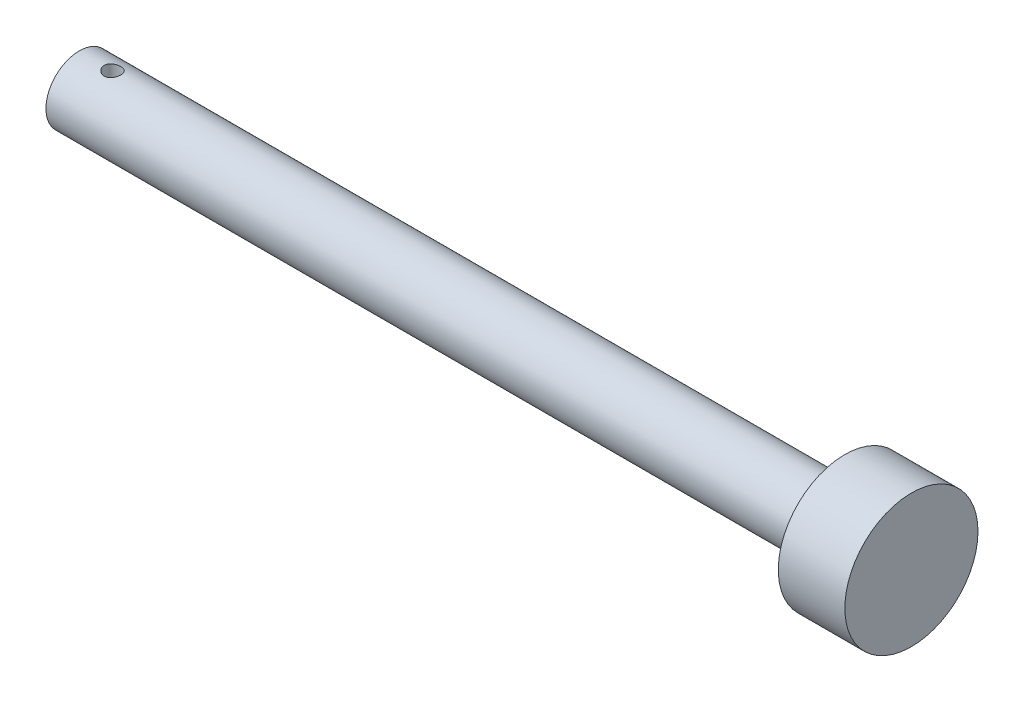
ISO-10303-21;
HEADER;
FILE_DESCRIPTION(('STEP AP214'),'2;1');
FILE_NAME('part.step','',(''),(''),'','','');
FILE_SCHEMA(('AUTOMOTIVE_DESIGN { 1 0 10303 214 1 1 1 1 }'));
ENDSEC;
DATA;
#1=APPLICATION_CONTEXT('core data for automotive mechanical design processes');
#2=APPLICATION_PROTOCOL_DEFINITION('international standard','automotive_design',2000,#1);
#3=PRODUCT_CONTEXT('',#1,'mechanical');
#4=PRODUCT('Part','Part','',(#3));
#5=PRODUCT_RELATED_PRODUCT_CATEGORY('part','',(#4));
#6=PRODUCT_DEFINITION_FORMATION('','',#4);
#7=PRODUCT_DEFINITION_CONTEXT('part definition',#1,'design');
#8=PRODUCT_DEFINITION('design','',#6,#7);
#9=PRODUCT_DEFINITION_SHAPE('','',#8);
#10=(LENGTH_UNIT() NAMED_UNIT(*) SI_UNIT(.MILLI.,.METRE.));
#11=(NAMED_UNIT(*) PLANE_ANGLE_UNIT() SI_UNIT($,.RADIAN.));
#12=(NAMED_UNIT(*) SI_UNIT($,.STERADIAN.) SOLID_ANGLE_UNIT());
#13=UNCERTAINTY_MEASURE_WITH_UNIT(LENGTH_MEASURE(1.E-05),#10,'distance_accuracy_value','');
#14=(GEOMETRIC_REPRESENTATION_CONTEXT(3) GLOBAL_UNCERTAINTY_ASSIGNED_CONTEXT((#13)) GLOBAL_UNIT_ASSIGNED_CONTEXT((#10,
#11,#12)) REPRESENTATION_CONTEXT('',''));
#15=CARTESIAN_POINT('',(0.,0.,0.));
#16=DIRECTION('',(0.,0.,1.));
#17=DIRECTION('',(1.,0.,0.));
#18=AXIS2_PLACEMENT_3D('',#15,#16,#17);
#19=CARTESIAN_POINT('',(16.,0.,0.));
#20=DIRECTION('',(-1.,0.,0.));
#21=DIRECTION('',(0.,0.,1.));
#22=AXIS2_PLACEMENT_3D('',#19,#20,#21);
#23=CYLINDRICAL_SURFACE('',#22,16.);
#24=CARTESIAN_POINT('',(16.,0.,0.));
#25=DIRECTION('',(1.,0.,0.));
#26=DIRECTION('',(0.,0.,-1.));
#27=AXIS2_PLACEMENT_3D('',#24,#25,#26);
#28=CIRCLE('',#27,16.);
#29=CARTESIAN_POINT('',(16.,0.,-16.));
#30=VERTEX_POINT('',#29);
#31=EDGE_CURVE('E10',#30,#30,#28,.T.);
#32=ORIENTED_EDGE('',*,*,#31,.F.);
#33=EDGE_LOOP('',(#32));
#34=FACE_BOUND('',#33,.T.);
#35=CARTESIAN_POINT('',(0.,0.,0.));
#36=DIRECTION('',(1.,0.,0.));
#37=DIRECTION('',(0.,0.,-1.));
#38=AXIS2_PLACEMENT_3D('',#35,#36,#37);
#39=CIRCLE('',#38,16.);
#40=CARTESIAN_POINT('',(0.,0.,-16.));
#41=VERTEX_POINT('',#40);
#42=EDGE_CURVE('E41',#41,#41,#39,.T.);
#43=ORIENTED_EDGE('',*,*,#42,.T.);
#44=EDGE_LOOP('',(#43));
#45=FACE_BOUND('',#44,.T.);
#46=ADVANCED_FACE('F30',(#34,#45),#23,.T.);
#47=CARTESIAN_POINT('',(16.,0.,0.));
#48=DIRECTION('',(1.,0.,0.));
#49=DIRECTION('',(0.,0.,-1.));
#50=AXIS2_PLACEMENT_3D('',#47,#48,#49);
#51=PLANE('',#50);
#52=ORIENTED_EDGE('',*,*,#31,.T.);
#53=EDGE_LOOP('',(#52));
#54=FACE_BOUND('',#53,.T.);
#55=ADVANCED_FACE('F75',(#54),#51,.T.);
#56=CARTESIAN_POINT('',(0.,0.,0.));
#57=DIRECTION('',(1.,0.,0.));
#58=DIRECTION('',(0.,0.,-1.));
#59=AXIS2_PLACEMENT_3D('',#56,#57,#58);
#60=PLANE('',#59);
#61=CARTESIAN_POINT('',(0.,0.,0.));
#62=DIRECTION('',(1.,0.,0.));
#63=DIRECTION('',(0.,0.,-1.));
#64=AXIS2_PLACEMENT_3D('',#61,#62,#63);
#65=CIRCLE('',#64,8.);
#66=CARTESIAN_POINT('',(0.,0.,-8.));
#67=VERTEX_POINT('',#66);
#68=EDGE_CURVE('E46',#67,#67,#65,.T.);
#69=ORIENTED_EDGE('',*,*,#68,.T.);
#70=EDGE_LOOP('',(#69));
#71=FACE_BOUND('',#70,.T.);
#72=ORIENTED_EDGE('',*,*,#42,.F.);
#73=EDGE_LOOP('',(#72));
#74=FACE_BOUND('',#73,.T.);
#75=ADVANCED_FACE('F71',(#71,#74),#60,.F.);
#76=CARTESIAN_POINT('',(-184.,0.,0.));
#77=DIRECTION('',(1.,0.,0.));
#78=DIRECTION('',(0.,0.,-1.));
#79=AXIS2_PLACEMENT_3D('',#76,#77,#78);
#80=CYLINDRICAL_SURFACE('',#79,8.);
#81=CARTESIAN_POINT('',(-176.,-7.74596669241483,2.));
#82=CARTESIAN_POINT('',(-176.110440600741,-7.74596880070288,1.99999686287445));
#83=CARTESIAN_POINT('',(-176.220915918943,-7.74835444811678,1.99082099639812));
#84=CARTESIAN_POINT('',(-176.438694062539,-7.75761489594051,1.95441850037103));
#85=CARTESIAN_POINT('',(-176.545995003575,-7.76449230897304,1.92718136539368));
#86=CARTESIAN_POINT('',(-176.75424283055,-7.7819097967692,1.85559295970563));
#87=CARTESIAN_POINT('',(-176.855197724309,-7.79244514152366,1.81126378228359));
#88=CARTESIAN_POINT('',(-177.048248682032,-7.81598553623007,1.7068169130091));
#89=CARTESIAN_POINT('',(-177.140344369664,-7.82899069102791,1.64669855084854));
#90=CARTESIAN_POINT('',(-177.31508931621,-7.856325730845,1.51096674184949));
#91=CARTESIAN_POINT('',(-177.39751488028,-7.87067678098428,1.43506951016323));
#92=CARTESIAN_POINT('',(-177.548609115488,-7.89890300412235,1.27054565128053));
#93=CARTESIAN_POINT('',(-177.617276500497,-7.91277813253111,1.18191783534424));
#94=CARTESIAN_POINT('',(-177.739820374105,-7.93872332416466,0.99291616086316));
#95=CARTESIAN_POINT('',(-177.793477110529,-7.95076549920474,0.892395660956087));
#96=CARTESIAN_POINT('',(-177.883047715322,-7.97144649540787,0.683410547434192));
#97=CARTESIAN_POINT('',(-177.918964201532,-7.98008581867476,0.574947108633533));
#98=CARTESIAN_POINT('',(-177.971318267663,-7.99283807078544,0.355487007003311));
#99=CARTESIAN_POINT('',(-177.988135715461,-7.99703915075451,0.244586175639165));
#100=CARTESIAN_POINT('',(-178.00300670342,-8.00074875285838,0.0214630554102058));
#101=CARTESIAN_POINT('',(-178.001063017768,-8.00025796877363,-0.0907590356304626));
#102=CARTESIAN_POINT('',(-177.9787401198,-7.99470475962828,-0.310704494344781));
#103=CARTESIAN_POINT('',(-177.958770939957,-7.98974401872699,-0.41847243120214));
#104=CARTESIAN_POINT('',(-177.901622983961,-7.97592669219883,-0.62907649482738));
#105=CARTESIAN_POINT('',(-177.864443291698,-7.96706989918753,-0.731912358740885));
#106=CARTESIAN_POINT('',(-177.77359794345,-7.94630007760716,-0.930813407003623));
#107=CARTESIAN_POINT('',(-177.719786364271,-7.93436015756043,-1.02680901953302));
#108=CARTESIAN_POINT('',(-177.597315456707,-7.90871923047719,-1.20855124468098));
#109=CARTESIAN_POINT('',(-177.528653545151,-7.89501791721992,-1.29429607017102));
#110=CARTESIAN_POINT('',(-177.376233006414,-7.86690971015616,-1.45554807016992));
#111=CARTESIAN_POINT('',(-177.292116086122,-7.85249375620734,-1.53071535815041));
#112=CARTESIAN_POINT('',(-177.112320021168,-7.82492034813365,-1.66595275192605));
#113=CARTESIAN_POINT('',(-177.016640336407,-7.81176295284776,-1.72602215209204));
#114=CARTESIAN_POINT('',(-176.815767972681,-7.78816397465319,-1.8295762580452));
#115=CARTESIAN_POINT('',(-176.710531415749,-7.77773586980576,-1.87297913394098));
#116=CARTESIAN_POINT('',(-176.493931625539,-7.76094912111965,-1.94137124127268));
#117=CARTESIAN_POINT('',(-176.382569708813,-7.75458960648175,-1.96636441310582));
#118=CARTESIAN_POINT('',(-176.160032398781,-7.74684284831313,-1.99666371093214));
#119=CARTESIAN_POINT('',(-176.048929765336,-7.74532871274919,-2.0024723791357));
#120=CARTESIAN_POINT('',(-175.827342450737,-7.74709874784832,-1.99561359241243));
#121=CARTESIAN_POINT('',(-175.716857713639,-7.75038247681013,-1.98294783827903));
#122=CARTESIAN_POINT('',(-175.501508588036,-7.76125665563648,-1.93994037115012));
#123=CARTESIAN_POINT('',(-175.396581818743,-7.768775761875,-1.90989125462539));
#124=CARTESIAN_POINT('',(-175.193254833719,-7.7872057461677,-1.83329446533649));
#125=CARTESIAN_POINT('',(-175.094855392756,-7.79811702598891,-1.78674483817003));
#126=CARTESIAN_POINT('',(-174.905246977706,-7.8223690967461,-1.67741653434924));
#127=CARTESIAN_POINT('',(-174.814216927966,-7.83575334885313,-1.6143374030685));
#128=CARTESIAN_POINT('',(-174.643849309759,-7.86333666457373,-1.47412058586891));
#129=CARTESIAN_POINT('',(-174.56451366668,-7.87753586182776,-1.39698058961087));
#130=CARTESIAN_POINT('',(-174.417751165943,-7.90557922425285,-1.22852544196945));
#131=CARTESIAN_POINT('',(-174.350671949961,-7.91940561649468,-1.13690390506318));
#132=CARTESIAN_POINT('',(-174.232851306439,-7.94477773290987,-0.943405365389348));
#133=CARTESIAN_POINT('',(-174.182109026713,-7.95632357603169,-0.841528897915179));
#134=CARTESIAN_POINT('',(-174.098843172378,-7.9757609259065,-0.631116403462178));
#135=CARTESIAN_POINT('',(-174.066188572497,-7.98367864017925,-0.52263476205576));
#136=CARTESIAN_POINT('',(-174.019631732313,-7.99508234716634,-0.301499520637607));
#137=CARTESIAN_POINT('',(-174.005725873009,-7.99856919514738,-0.188846730082474));
#138=CARTESIAN_POINT('',(-173.997264820849,-8.00068338817612,0.0341670528866548));
#139=CARTESIAN_POINT('',(-174.002196581809,-7.99943957759977,0.144507653932052));
#140=CARTESIAN_POINT('',(-174.030095654589,-7.99251792914887,0.36273499282951));
#141=CARTESIAN_POINT('',(-174.053062430026,-7.98684022314338,0.470621803561865));
#142=CARTESIAN_POINT('',(-174.116104439542,-7.97170865707778,0.68034207128956));
#143=CARTESIAN_POINT('',(-174.156086906629,-7.96227529004785,0.782204989161742));
#144=CARTESIAN_POINT('',(-174.251941158039,-7.94062577827316,0.977834106083264));
#145=CARTESIAN_POINT('',(-174.307814945341,-7.92840928277515,1.07159928253128));
#146=CARTESIAN_POINT('',(-174.435430467992,-7.90214499360574,1.25080385684661));
#147=CARTESIAN_POINT('',(-174.507520285808,-7.88806033883329,1.33598997659667));
#148=CARTESIAN_POINT('',(-174.664845703955,-7.85981298114379,1.49323004054701));
#149=CARTESIAN_POINT('',(-174.750084632222,-7.84565025934605,1.56528065015318));
#150=CARTESIAN_POINT('',(-174.933202828379,-7.81854951691005,1.69552405294367));
#151=CARTESIAN_POINT('',(-175.03128824673,-7.80563927346577,1.75343323883277));
#152=CARTESIAN_POINT('',(-175.23611097975,-7.78287910989656,1.85185379317095));
#153=CARTESIAN_POINT('',(-175.342841932188,-7.77302696466427,1.89237781950431));
#154=CARTESIAN_POINT('',(-175.54115402367,-7.75903817501475,1.948845057142));
#155=CARTESIAN_POINT('',(-175.631786328772,-7.75417326006998,1.96798634119375));
#156=CARTESIAN_POINT('',(-175.814937737995,-7.7476367716524,1.99356458514353));
#157=CARTESIAN_POINT('',(-175.907456680489,-7.74596492578216,2.0000026287435));
#158=CARTESIAN_POINT('',(-176.,-7.74596669241483,2.));
#159=B_SPLINE_CURVE_WITH_KNOTS('',3,(#81,#82,#83,#84,#85,#86,#87,#88,#89,#90,#91,#92,#93,#94,
#95,#96,#97,#98,#99,#100,#101,#102,#103,#104,#105,#106,#107,#108,#109,#110,#111,#112,#113,#114,
#115,#116,#117,#118,#119,#120,#121,#122,#123,#124,#125,#126,#127,#128,#129,#130,#131,#132,#133,
#134,#135,#136,#137,#138,#139,#140,#141,#142,#143,#144,#145,#146,#147,#148,#149,#150,#151,#152,
#153,#154,#155,#156,#157,#158),.UNSPECIFIED.,.T.,.F.,(4,2,2,2,2,2,2,2,2,2,2,2,2,2,2,2,2,2,2,2,2,
2,2,2,2,2,2,2,2,2,2,2,2,2,2,2,2,2,4),(0.,0.330981953388902,0.662156593142942,0.992904581732789,
1.32366661404385,1.66099163354379,1.99834817183892,2.34041197118337,2.68242527877675,
3.01751000796277,3.35254518932816,3.68014610151157,4.00776445379829,4.33834299403556,
4.66897908375129,5.00856373257529,5.34816424959842,5.68941145606722,6.03058560103639,
6.36274859809374,6.69488101747042,7.02157924007365,7.34831617137131,7.68146276687324,
8.01466415108033,8.35620264772254,8.6977233257564,9.03673658245541,9.37568439127229,
9.70546756901963,10.0352409390158,10.3632390124777,10.6912784459046,11.0271767726565,
11.363160252524,11.7054118182895,12.0474137709605,12.3247826174462,12.6021278008237),.UNSPECIFIED.);
#160=CARTESIAN_POINT('',(-176.,-7.74596669241483,2.));
#161=VERTEX_POINT('',#160);
#162=EDGE_CURVE('E33',#161,#161,#159,.T.);
#163=ORIENTED_EDGE('',*,*,#162,.F.);
#164=EDGE_LOOP('',(#163));
#165=FACE_BOUND('',#164,.T.);
#166=CARTESIAN_POINT('',(-176.,7.74596669241483,2.));
#167=CARTESIAN_POINT('',(-175.889559399259,7.74596880070288,1.99999686287445));
#168=CARTESIAN_POINT('',(-175.779084081057,7.74835444811678,1.99082099639812));
#169=CARTESIAN_POINT('',(-175.561305937461,7.75761489594051,1.95441850037103));
#170=CARTESIAN_POINT('',(-175.454004996425,7.76449230897304,1.92718136539368));
#171=CARTESIAN_POINT('',(-175.24575716945,7.78190979676921,1.85559295970562));
#172=CARTESIAN_POINT('',(-175.144802275691,7.79244514152367,1.81126378228357));
#173=CARTESIAN_POINT('',(-174.951751317968,7.81598553623007,1.70681691300908));
#174=CARTESIAN_POINT('',(-174.859655630336,7.82899069102792,1.64669855084853));
#175=CARTESIAN_POINT('',(-174.68491068379,7.856325730845,1.51096674184949));
#176=CARTESIAN_POINT('',(-174.60248511972,7.87067678098428,1.43506951016323));
#177=CARTESIAN_POINT('',(-174.451390884512,7.89890300412235,1.27054565128053));
#178=CARTESIAN_POINT('',(-174.382723499503,7.91277813253111,1.18191783534424));
#179=CARTESIAN_POINT('',(-174.260179625895,7.93872332416466,0.992916160863162));
#180=CARTESIAN_POINT('',(-174.206522889471,7.95076549920474,0.892395660956094));
#181=CARTESIAN_POINT('',(-174.116952284678,7.97144649540787,0.6834105474342));
#182=CARTESIAN_POINT('',(-174.081035798468,7.98008581867476,0.574947108633536));
#183=CARTESIAN_POINT('',(-174.028681732337,7.99283807078544,0.355487007003311));
#184=CARTESIAN_POINT('',(-174.011864284539,7.99703915075451,0.244586175639165));
#185=CARTESIAN_POINT('',(-173.99699329658,8.00074875285838,0.0214630554102059));
#186=CARTESIAN_POINT('',(-173.998936982232,8.00025796877363,-0.0907590356304624));
#187=CARTESIAN_POINT('',(-174.0212598802,7.99470475962828,-0.310704494344781));
#188=CARTESIAN_POINT('',(-174.041229060043,7.98974401872699,-0.418472431202141));
#189=CARTESIAN_POINT('',(-174.098377016039,7.97592669219883,-0.62907649482738));
#190=CARTESIAN_POINT('',(-174.135556708302,7.96706989918753,-0.731912358740883));
#191=CARTESIAN_POINT('',(-174.22640205655,7.94630007760716,-0.930813407003617));
#192=CARTESIAN_POINT('',(-174.280213635729,7.93436015756043,-1.02680901953301));
#193=CARTESIAN_POINT('',(-174.402684543293,7.90871923047719,-1.20855124468098));
#194=CARTESIAN_POINT('',(-174.471346454848,7.89501791721992,-1.29429607017101));
#195=CARTESIAN_POINT('',(-174.623766993586,7.86690971015616,-1.45554807016992));
#196=CARTESIAN_POINT('',(-174.707883913878,7.85249375620734,-1.53071535815041));
#197=CARTESIAN_POINT('',(-174.887679978832,7.82492034813365,-1.66595275192605));
#198=CARTESIAN_POINT('',(-174.983359663593,7.81176295284776,-1.72602215209204));
#199=CARTESIAN_POINT('',(-175.184232027319,7.78816397465319,-1.8295762580452));
#200=CARTESIAN_POINT('',(-175.289468584251,7.77773586980576,-1.87297913394099));
#201=CARTESIAN_POINT('',(-175.506068374461,7.76094912111965,-1.94137124127269));
#202=CARTESIAN_POINT('',(-175.617430291187,7.75458960648175,-1.96636441310582));
#203=CARTESIAN_POINT('',(-175.839967601219,7.74684284831313,-1.99666371093214));
#204=CARTESIAN_POINT('',(-175.951070234664,7.74532871274919,-2.0024723791357));
#205=CARTESIAN_POINT('',(-176.172657549263,7.74709874784832,-1.99561359241243));
#206=CARTESIAN_POINT('',(-176.283142286361,7.75038247681013,-1.98294783827903));
#207=CARTESIAN_POINT('',(-176.498491411964,7.76125665563648,-1.93994037115012));
#208=CARTESIAN_POINT('',(-176.603418181257,7.768775761875,-1.90989125462539));
#209=CARTESIAN_POINT('',(-176.806745166281,7.7872057461677,-1.83329446533649));
#210=CARTESIAN_POINT('',(-176.905144607244,7.79811702598891,-1.78674483817003));
#211=CARTESIAN_POINT('',(-177.094753022294,7.8223690967461,-1.67741653434924));
#212=CARTESIAN_POINT('',(-177.185783072034,7.83575334885313,-1.6143374030685));
#213=CARTESIAN_POINT('',(-177.356150690241,7.86333666457373,-1.47412058586891));
#214=CARTESIAN_POINT('',(-177.43548633332,7.87753586182776,-1.39698058961087));
#215=CARTESIAN_POINT('',(-177.582248834057,7.90557922425285,-1.22852544196945));
#216=CARTESIAN_POINT('',(-177.649328050039,7.91940561649468,-1.13690390506318));
#217=CARTESIAN_POINT('',(-177.767148693561,7.94477773290987,-0.943405365389348));
#218=CARTESIAN_POINT('',(-177.817890973287,7.95632357603169,-0.841528897915179));
#219=CARTESIAN_POINT('',(-177.901156827622,7.9757609259065,-0.631116403462178));
#220=CARTESIAN_POINT('',(-177.933811427503,7.98367864017925,-0.52263476205576));
#221=CARTESIAN_POINT('',(-177.980368267687,7.99508234716634,-0.301499520637607));
#222=CARTESIAN_POINT('',(-177.994274126991,7.99856919514738,-0.188846730082474));
#223=CARTESIAN_POINT('',(-178.002735179151,8.00068338817612,0.0341670528866548));
#224=CARTESIAN_POINT('',(-177.997803418191,7.99943957759977,0.144507653932052));
#225=CARTESIAN_POINT('',(-177.969904345411,7.99251792914887,0.36273499282951));
#226=CARTESIAN_POINT('',(-177.946937569974,7.98684022314338,0.470621803561865));
#227=CARTESIAN_POINT('',(-177.883895560458,7.97170865707778,0.680342071289556));
#228=CARTESIAN_POINT('',(-177.843913093371,7.96227529004785,0.782204989161734));
#229=CARTESIAN_POINT('',(-177.748058841961,7.94062577827316,0.977834106083256));
#230=CARTESIAN_POINT('',(-177.692185054659,7.92840928277515,1.07159928253127));
#231=CARTESIAN_POINT('',(-177.564569532008,7.90214499360574,1.25080385684661));
#232=CARTESIAN_POINT('',(-177.492479714192,7.88806033883329,1.33598997659667));
#233=CARTESIAN_POINT('',(-177.335154296045,7.85981298114379,1.49323004054701));
#234=CARTESIAN_POINT('',(-177.249915367778,7.84565025934604,1.56528065015318));
#235=CARTESIAN_POINT('',(-177.066797171621,7.81854951691005,1.69552405294365));
#236=CARTESIAN_POINT('',(-176.96871175327,7.80563927346578,1.75343323883274));
#237=CARTESIAN_POINT('',(-176.76388902025,7.78287910989656,1.85185379317092));
#238=CARTESIAN_POINT('',(-176.657158067812,7.77302696466428,1.8923778195043));
#239=CARTESIAN_POINT('',(-176.45884597633,7.75903817501475,1.948845057142));
#240=CARTESIAN_POINT('',(-176.368213671228,7.75417326006998,1.96798634119375));
#241=CARTESIAN_POINT('',(-176.185062262005,7.7476367716524,1.99356458514353));
#242=CARTESIAN_POINT('',(-176.092543319511,7.74596492578216,2.0000026287435));
#243=CARTESIAN_POINT('',(-176.,7.74596669241483,2.));
#244=B_SPLINE_CURVE_WITH_KNOTS('',3,(#166,#167,#168,#169,#170,#171,#172,#173,#174,#175,#176,
#177,#178,#179,#180,#181,#182,#183,#184,#185,#186,#187,#188,#189,#190,#191,#192,#193,#194,#195,
#196,#197,#198,#199,#200,#201,#202,#203,#204,#205,#206,#207,#208,#209,#210,#211,#212,#213,#214,
#215,#216,#217,#218,#219,#220,#221,#222,#223,#224,#225,#226,#227,#228,#229,#230,#231,#232,#233,
#234,#235,#236,#237,#238,#239,#240,#241,#242,#243),.UNSPECIFIED.,.T.,.F.,(4,2,2,2,2,2,2,2,2,2,2,
2,2,2,2,2,2,2,2,2,2,2,2,2,2,2,2,2,2,2,2,2,2,2,2,2,2,2,4),(0.,0.330981953388902,
0.662156593142942,0.992904581732879,1.32366661404385,1.6609916335438,1.99834817183892,
2.34041197118337,2.68242527877675,3.01751000796278,3.35254518932816,3.68014610151158,
4.00776445379829,4.33834299403554,4.66897908375129,5.0085637325753,5.34816424959842,
5.68941145606725,6.0305856010364,6.36274859809374,6.69488101747043,7.02157924007366,
7.34831617137131,7.68146276687324,8.01466415108034,8.35620264772254,8.6977233257564,
9.03673658245542,9.37568439127229,9.70546756901964,10.0352409390158,10.3632390124777,
10.6912784459046,11.0271767726565,11.3631602525241,11.7054118182894,12.0474137709605,
12.3247826174462,12.6021278008237),.UNSPECIFIED.);
#245=CARTESIAN_POINT('',(-176.,7.74596669241483,2.));
#246=VERTEX_POINT('',#245);
#247=EDGE_CURVE('E52',#246,#246,#244,.T.);
#248=ORIENTED_EDGE('',*,*,#247,.F.);
#249=EDGE_LOOP('',(#248));
#250=FACE_BOUND('',#249,.T.);
#251=CARTESIAN_POINT('',(-184.,0.,0.));
#252=DIRECTION('',(1.,0.,0.));
#253=DIRECTION('',(0.,0.,-1.));
#254=AXIS2_PLACEMENT_3D('',#251,#252,#253);
#255=CIRCLE('',#254,8.);
#256=CARTESIAN_POINT('',(-184.,0.,-8.));
#257=VERTEX_POINT('',#256);
#258=EDGE_CURVE('E49',#257,#257,#255,.T.);
#259=ORIENTED_EDGE('',*,*,#258,.T.);
#260=EDGE_LOOP('',(#259));
#261=FACE_BOUND('',#260,.T.);
#262=ORIENTED_EDGE('',*,*,#68,.F.);
#263=EDGE_LOOP('',(#262));
#264=FACE_BOUND('',#263,.T.);
#265=ADVANCED_FACE('F56',(#165,#250,#261,#264),#80,.T.);
#266=CARTESIAN_POINT('',(-184.,0.,0.));
#267=DIRECTION('',(1.,0.,0.));
#268=DIRECTION('',(0.,0.,-1.));
#269=AXIS2_PLACEMENT_3D('',#266,#267,#268);
#270=PLANE('',#269);
#271=ORIENTED_EDGE('',*,*,#258,.F.);
#272=EDGE_LOOP('',(#271));
#273=FACE_BOUND('',#272,.T.);
#274=ADVANCED_FACE('F63',(#273),#270,.F.);
#275=CARTESIAN_POINT('',(-176.,-16.,0.));
#276=DIRECTION('',(0.,1.,0.));
#277=DIRECTION('',(0.,0.,1.));
#278=AXIS2_PLACEMENT_3D('',#275,#276,#277);
#279=CYLINDRICAL_SURFACE('',#278,2.);
#280=ORIENTED_EDGE('',*,*,#162,.T.);
#281=EDGE_LOOP('',(#280));
#282=FACE_BOUND('',#281,.T.);
#283=ORIENTED_EDGE('',*,*,#247,.T.);
#284=EDGE_LOOP('',(#283));
#285=FACE_BOUND('',#284,.T.);
#286=ADVANCED_FACE('F60',(#282,#285),#279,.F.);
#287=CLOSED_SHELL('',(#46,#55,#75,#265,#274,#286));
#288=MANIFOLD_SOLID_BREP('B2',#287);
#289=ADVANCED_BREP_SHAPE_REPRESENTATION('',(#18,#288),#14);
#290=SHAPE_DEFINITION_REPRESENTATION(#9,#289);
ENDSEC;
END-ISO-10303-21;
